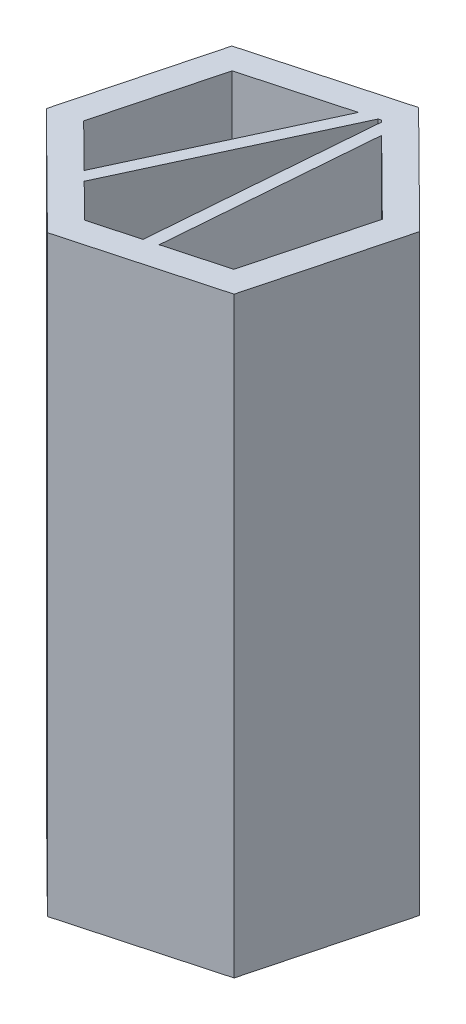
ISO-10303-21;
HEADER;
FILE_DESCRIPTION(('STEP AP214'),'2;1');
FILE_NAME('part.step','',(''),(''),'','','');
FILE_SCHEMA(('AUTOMOTIVE_DESIGN { 1 0 10303 214 1 1 1 1 }'));
ENDSEC;
DATA;
#1=APPLICATION_CONTEXT('core data for automotive mechanical design processes');
#2=APPLICATION_PROTOCOL_DEFINITION('international standard','automotive_design',2000,#1);
#3=PRODUCT_CONTEXT('',#1,'mechanical');
#4=PRODUCT('Part','Part','',(#3));
#5=PRODUCT_RELATED_PRODUCT_CATEGORY('part','',(#4));
#6=PRODUCT_DEFINITION_FORMATION('','',#4);
#7=PRODUCT_DEFINITION_CONTEXT('part definition',#1,'design');
#8=PRODUCT_DEFINITION('design','',#6,#7);
#9=PRODUCT_DEFINITION_SHAPE('','',#8);
#10=(LENGTH_UNIT() NAMED_UNIT(*) SI_UNIT(.MILLI.,.METRE.));
#11=(NAMED_UNIT(*) PLANE_ANGLE_UNIT() SI_UNIT($,.RADIAN.));
#12=(NAMED_UNIT(*) SI_UNIT($,.STERADIAN.) SOLID_ANGLE_UNIT());
#13=UNCERTAINTY_MEASURE_WITH_UNIT(LENGTH_MEASURE(1.E-05),#10,'distance_accuracy_value','');
#14=(GEOMETRIC_REPRESENTATION_CONTEXT(3) GLOBAL_UNCERTAINTY_ASSIGNED_CONTEXT((#13)) GLOBAL_UNIT_ASSIGNED_CONTEXT((#10,
#11,#12)) REPRESENTATION_CONTEXT('',''));
#15=CARTESIAN_POINT('',(0.,0.,0.));
#16=DIRECTION('',(0.,0.,1.));
#17=DIRECTION('',(1.,0.,0.));
#18=AXIS2_PLACEMENT_3D('',#15,#16,#17);
#19=CARTESIAN_POINT('',(-2.34599991066505,45.,8.93474217605035));
#20=DIRECTION('',(-0.263669614670392,0.,-0.964613048999218));
#21=DIRECTION('',(-0.964613048999218,0.,0.263669614670392));
#22=AXIS2_PLACEMENT_3D('',#19,#20,#21);
#23=PLANE('',#22);
#24=DIRECTION('',(0.,1.,0.));
#25=VECTOR('',#24,1.);
#26=CARTESIAN_POINT('',(1.14474386836392,0.,7.98057400666413));
#27=LINE('',#26,#25);
#28=CARTESIAN_POINT('',(1.14474386836392,0.,7.98057400666413));
#29=VERTEX_POINT('',#28);
#30=CARTESIAN_POINT('',(1.14474386836392,45.,7.98057400666413));
#31=VERTEX_POINT('',#30);
#32=EDGE_CURVE('E211',#29,#31,#27,.T.);
#33=ORIENTED_EDGE('',*,*,#32,.F.);
#34=DIRECTION('',(0.964613048999218,0.,-0.263669614670392));
#35=VECTOR('',#34,1.);
#36=CARTESIAN_POINT('',(-2.34599991066505,0.,8.93474217605035));
#37=LINE('',#36,#35);
#38=CARTESIAN_POINT('',(-2.34599991066505,0.,8.93474217605035));
#39=VERTEX_POINT('',#38);
#40=EDGE_CURVE('E275',#39,#29,#37,.T.);
#41=ORIENTED_EDGE('',*,*,#40,.F.);
#42=DIRECTION('',(0.,-1.,0.));
#43=VECTOR('',#42,1.);
#44=CARTESIAN_POINT('',(-2.34599991066505,45.,8.93474217605035));
#45=LINE('',#44,#43);
#46=CARTESIAN_POINT('',(-2.34599991066505,45.,8.93474217605035));
#47=VERTEX_POINT('',#46);
#48=EDGE_CURVE('E314',#47,#39,#45,.T.);
#49=ORIENTED_EDGE('',*,*,#48,.F.);
#50=DIRECTION('',(0.964613048999218,0.,-0.263669614670392));
#51=VECTOR('',#50,1.);
#52=CARTESIAN_POINT('',(-2.34599991066505,45.,8.93474217605035));
#53=LINE('',#52,#51);
#54=EDGE_CURVE('E55',#47,#31,#53,.T.);
#55=ORIENTED_EDGE('',*,*,#54,.T.);
#56=EDGE_LOOP('',(#33,#41,#49,#55));
#57=FACE_BOUND('',#56,.T.);
#58=ADVANCED_FACE('F39',(#57),#23,.T.);
#59=CARTESIAN_POINT('',(8.91071365605638,45.,-2.43567556811322));
#60=DIRECTION('',(-0.703544597920089,0.,0.710651109010223));
#61=DIRECTION('',(0.710651109010223,0.,0.703544597920089));
#62=AXIS2_PLACEMENT_3D('',#59,#60,#61);
#63=PLANE('',#62);
#64=DIRECTION('',(0.,1.,0.));
#65=VECTOR('',#64,1.);
#66=CARTESIAN_POINT('',(2.48813013246709,0.,-8.79403325646633));
#67=LINE('',#66,#65);
#68=CARTESIAN_POINT('',(2.48813013246709,0.,-8.79403325646633));
#69=VERTEX_POINT('',#68);
#70=CARTESIAN_POINT('',(2.48813013246709,45.,-8.79403325646633));
#71=VERTEX_POINT('',#70);
#72=EDGE_CURVE('E215',#69,#71,#67,.T.);
#73=ORIENTED_EDGE('',*,*,#72,.T.);
#74=DIRECTION('',(-0.710651109010223,0.,-0.703544597920089));
#75=VECTOR('',#74,1.);
#76=CARTESIAN_POINT('',(8.91071365605638,45.,-2.43567556811322));
#77=LINE('',#76,#75);
#78=CARTESIAN_POINT('',(2.34599991066505,45.,-8.93474217605035));
#79=VERTEX_POINT('',#78);
#80=EDGE_CURVE('E259',#71,#79,#77,.T.);
#81=ORIENTED_EDGE('',*,*,#80,.T.);
#82=DIRECTION('',(0.,-1.,0.));
#83=VECTOR('',#82,1.);
#84=CARTESIAN_POINT('',(2.34599991066505,45.,-8.93474217605035));
#85=LINE('',#84,#83);
#86=CARTESIAN_POINT('',(2.34599991066505,0.,-8.93474217605035));
#87=VERTEX_POINT('',#86);
#88=EDGE_CURVE('E304',#79,#87,#85,.T.);
#89=ORIENTED_EDGE('',*,*,#88,.T.);
#90=DIRECTION('',(-0.710651109010223,0.,-0.703544597920089));
#91=VECTOR('',#90,1.);
#92=CARTESIAN_POINT('',(8.91071365605638,0.,-2.43567556811322));
#93=LINE('',#92,#91);
#94=EDGE_CURVE('E283',#69,#87,#93,.T.);
#95=ORIENTED_EDGE('',*,*,#94,.F.);
#96=EDGE_LOOP('',(#73,#81,#89,#95));
#97=FACE_BOUND('',#96,.T.);
#98=ADVANCED_FACE('F418',(#97),#63,.T.);
#99=CARTESIAN_POINT('',(-8.91071365605638,45.,2.43567556811322));
#100=DIRECTION('',(0.703544597920089,0.,-0.710651109010223));
#101=DIRECTION('',(-0.710651109010223,0.,-0.703544597920089));
#102=AXIS2_PLACEMENT_3D('',#99,#100,#101);
#103=PLANE('',#102);
#104=DIRECTION('',(0.,1.,0.));
#105=VECTOR('',#104,1.);
#106=CARTESIAN_POINT('',(-5.62835678336072,0.,5.68520887208178));
#107=LINE('',#106,#105);
#108=CARTESIAN_POINT('',(-5.62835678336072,0.,5.68520887208178));
#109=VERTEX_POINT('',#108);
#110=CARTESIAN_POINT('',(-5.62835678336072,45.,5.68520887208178));
#111=VERTEX_POINT('',#110);
#112=EDGE_CURVE('E237',#109,#111,#107,.T.);
#113=ORIENTED_EDGE('',*,*,#112,.F.);
#114=DIRECTION('',(0.710651109010223,0.,0.703544597920089));
#115=VECTOR('',#114,1.);
#116=CARTESIAN_POINT('',(-8.91071365605638,0.,2.43567556811322));
#117=LINE('',#116,#115);
#118=CARTESIAN_POINT('',(-8.91071365605638,0.,2.43567556811322));
#119=VERTEX_POINT('',#118);
#120=EDGE_CURVE('E271',#119,#109,#117,.T.);
#121=ORIENTED_EDGE('',*,*,#120,.F.);
#122=DIRECTION('',(0.,-1.,0.));
#123=VECTOR('',#122,1.);
#124=CARTESIAN_POINT('',(-8.91071365605638,45.,2.43567556811322));
#125=LINE('',#124,#123);
#126=CARTESIAN_POINT('',(-8.91071365605638,45.,2.43567556811322));
#127=VERTEX_POINT('',#126);
#128=EDGE_CURVE('E270',#127,#119,#125,.T.);
#129=ORIENTED_EDGE('',*,*,#128,.F.);
#130=DIRECTION('',(0.710651109010223,0.,0.703544597920089));
#131=VECTOR('',#130,1.);
#132=CARTESIAN_POINT('',(-8.91071365605638,45.,2.43567556811322));
#133=LINE('',#132,#131);
#134=EDGE_CURVE('E188',#127,#111,#133,.T.);
#135=ORIENTED_EDGE('',*,*,#134,.T.);
#136=EDGE_LOOP('',(#113,#121,#129,#135));
#137=FACE_BOUND('',#136,.T.);
#138=ADVANCED_FACE('F414',(#137),#103,.T.);
#139=CARTESIAN_POINT('',(2.34599991066505,45.,-8.93474217605035));
#140=DIRECTION('',(0.263669614670392,0.,0.964613048999217));
#141=DIRECTION('',(0.964613048999218,0.,-0.263669614670392));
#142=AXIS2_PLACEMENT_3D('',#139,#140,#141);
#143=PLANE('',#142);
#144=DIRECTION('',(0.,1.,0.));
#145=VECTOR('',#144,1.);
#146=CARTESIAN_POINT('',(0.966484516861694,0.,-8.55766217211159));
#147=LINE('',#146,#145);
#148=CARTESIAN_POINT('',(0.966484516861695,0.,-8.55766217211159));
#149=VERTEX_POINT('',#148);
#150=CARTESIAN_POINT('',(0.966484516861694,45.,-8.55766217211159));
#151=VERTEX_POINT('',#150);
#152=EDGE_CURVE('E242',#149,#151,#147,.T.);
#153=ORIENTED_EDGE('',*,*,#152,.T.);
#154=DIRECTION('',(-0.964613048999217,0.,0.263669614670392));
#155=VECTOR('',#154,1.);
#156=CARTESIAN_POINT('',(2.34599991066505,45.,-8.93474217605035));
#157=LINE('',#156,#155);
#158=CARTESIAN_POINT('',(-6.56471374539133,45.,-6.49906660793713));
#159=VERTEX_POINT('',#158);
#160=EDGE_CURVE('E263',#151,#159,#157,.T.);
#161=ORIENTED_EDGE('',*,*,#160,.T.);
#162=DIRECTION('',(0.,-1.,0.));
#163=VECTOR('',#162,1.);
#164=CARTESIAN_POINT('',(-6.56471374539133,45.,-6.49906660793713));
#165=LINE('',#164,#163);
#166=CARTESIAN_POINT('',(-6.56471374539133,0.,-6.49906660793713));
#167=VERTEX_POINT('',#166);
#168=EDGE_CURVE('E300',#159,#167,#165,.T.);
#169=ORIENTED_EDGE('',*,*,#168,.T.);
#170=DIRECTION('',(-0.964613048999217,0.,0.263669614670392));
#171=VECTOR('',#170,1.);
#172=CARTESIAN_POINT('',(2.34599991066505,0.,-8.93474217605035));
#173=LINE('',#172,#171);
#174=EDGE_CURVE('E288',#149,#167,#173,.T.);
#175=ORIENTED_EDGE('',*,*,#174,.F.);
#176=EDGE_LOOP('',(#153,#161,#169,#175));
#177=FACE_BOUND('',#176,.T.);
#178=ADVANCED_FACE('F444',(#177),#143,.T.);
#179=CARTESIAN_POINT('',(0.,45.,0.));
#180=DIRECTION('',(0.,1.,0.));
#181=DIRECTION('',(0.,0.,1.));
#182=AXIS2_PLACEMENT_3D('',#179,#180,#181);
#183=PLANE('',#182);
#184=CARTESIAN_POINT('',(2.10935691736314,45.,7.71690439199374));
#185=VERTEX_POINT('',#184);
#186=CARTESIAN_POINT('',(6.56471374539133,45.,6.49906660793713));
#187=VERTEX_POINT('',#186);
#188=EDGE_CURVE('E179',#185,#187,#53,.T.);
#189=ORIENTED_EDGE('',*,*,#188,.F.);
#190=DIRECTION('',(0.0798289301867088,0.,-0.996808578366602));
#191=VECTOR('',#190,1.);
#192=CARTESIAN_POINT('',(2.10935691736314,45.,7.71690439199374));
#193=LINE('',#192,#191);
#194=CARTESIAN_POINT('',(3.36231847023682,45.,-7.92858680207433));
#195=VERTEX_POINT('',#194);
#196=EDGE_CURVE('E184',#185,#195,#193,.T.);
#197=ORIENTED_EDGE('',*,*,#196,.T.);
#198=CARTESIAN_POINT('',(8.91071365605638,45.,-2.43567556811322));
#199=VERTEX_POINT('',#198);
#200=EDGE_CURVE('E260',#199,#195,#77,.T.);
#201=ORIENTED_EDGE('',*,*,#200,.F.);
#202=DIRECTION('',(0.253961939988995,0.,-0.967214212590482));
#203=VECTOR('',#202,1.);
#204=CARTESIAN_POINT('',(6.56471374539133,45.,6.49906660793713));
#205=LINE('',#204,#203);
#206=EDGE_CURVE('E185',#187,#199,#205,.T.);
#207=ORIENTED_EDGE('',*,*,#206,.F.);
#208=EDGE_LOOP('',(#189,#197,#201,#207));
#209=FACE_BOUND('',#208,.T.);
#210=CARTESIAN_POINT('',(-4.91770567435049,45.,6.38875347000187));
#211=VERTEX_POINT('',#210);
#212=EDGE_CURVE('E254',#211,#47,#133,.T.);
#213=ORIENTED_EDGE('',*,*,#212,.F.);
#214=DIRECTION('',(0.420171811769034,0.,-0.907444570535703));
#215=VECTOR('',#214,1.);
#216=CARTESIAN_POINT('',(2.1530773008652,45.,-8.88200825311627));
#217=LINE('',#216,#215);
#218=CARTESIAN_POINT('',(2.1530773008652,45.,-8.88200825311627));
#219=VERTEX_POINT('',#218);
#220=EDGE_CURVE('E214',#211,#219,#217,.T.);
#221=ORIENTED_EDGE('',*,*,#220,.T.);
#222=EDGE_CURVE('E264',#79,#219,#157,.T.);
#223=ORIENTED_EDGE('',*,*,#222,.F.);
#224=ORIENTED_EDGE('',*,*,#80,.F.);
#225=DIRECTION('',(-0.079828930186709,0.,0.996808578366602));
#226=VECTOR('',#225,1.);
#227=CARTESIAN_POINT('',(2.48813013246709,45.,-8.79403325646633));
#228=LINE('',#227,#226);
#229=EDGE_CURVE('E202',#71,#31,#228,.T.);
#230=ORIENTED_EDGE('',*,*,#229,.T.);
#231=ORIENTED_EDGE('',*,*,#54,.F.);
#232=EDGE_LOOP('',(#213,#221,#223,#224,#230,#231));
#233=FACE_BOUND('',#232,.T.);
#234=DIRECTION('',(0.964613048999218,0.,-0.263669614670392));
#235=VECTOR('',#234,1.);
#236=CARTESIAN_POINT('',(-2.93249988833132,45.,11.1684277200629));
#237=LINE('',#236,#235);
#238=CARTESIAN_POINT('',(-2.93249988833132,45.,11.1684277200629));
#239=VERTEX_POINT('',#238);
#240=CARTESIAN_POINT('',(8.20589218173916,45.,8.12383325992142));
#241=VERTEX_POINT('',#240);
#242=EDGE_CURVE('E319',#239,#241,#237,.T.);
#243=ORIENTED_EDGE('',*,*,#242,.T.);
#244=DIRECTION('',(0.253961939988995,0.,-0.967214212590482));
#245=VECTOR('',#244,1.);
#246=CARTESIAN_POINT('',(8.20589218173916,45.,8.12383325992142));
#247=LINE('',#246,#245);
#248=CARTESIAN_POINT('',(11.1383920700705,45.,-3.04459446014152));
#249=VERTEX_POINT('',#248);
#250=EDGE_CURVE('E323',#241,#249,#247,.T.);
#251=ORIENTED_EDGE('',*,*,#250,.T.);
#252=DIRECTION('',(-0.710651109010223,0.,-0.703544597920089));
#253=VECTOR('',#252,1.);
#254=CARTESIAN_POINT('',(11.1383920700705,45.,-3.04459446014152));
#255=LINE('',#254,#253);
#256=CARTESIAN_POINT('',(2.93249988833131,45.,-11.1684277200629));
#257=VERTEX_POINT('',#256);
#258=EDGE_CURVE('E327',#249,#257,#255,.T.);
#259=ORIENTED_EDGE('',*,*,#258,.T.);
#260=DIRECTION('',(-0.964613048999218,0.,0.263669614670392));
#261=VECTOR('',#260,1.);
#262=CARTESIAN_POINT('',(2.93249988833131,45.,-11.1684277200629));
#263=LINE('',#262,#261);
#264=CARTESIAN_POINT('',(-8.20589218173916,45.,-8.12383325992142));
#265=VERTEX_POINT('',#264);
#266=EDGE_CURVE('E330',#257,#265,#263,.T.);
#267=ORIENTED_EDGE('',*,*,#266,.T.);
#268=DIRECTION('',(-0.253961939988995,0.,0.967214212590482));
#269=VECTOR('',#268,1.);
#270=CARTESIAN_POINT('',(-8.20589218173916,45.,-8.12383325992142));
#271=LINE('',#270,#269);
#272=CARTESIAN_POINT('',(-11.1383920700705,45.,3.04459446014152));
#273=VERTEX_POINT('',#272);
#274=EDGE_CURVE('E333',#265,#273,#271,.T.);
#275=ORIENTED_EDGE('',*,*,#274,.T.);
#276=DIRECTION('',(0.710651109010223,0.,0.70354459792009));
#277=VECTOR('',#276,1.);
#278=CARTESIAN_POINT('',(-11.1383920700705,45.,3.04459446014152));
#279=LINE('',#278,#277);
#280=EDGE_CURVE('E336',#273,#239,#279,.T.);
#281=ORIENTED_EDGE('',*,*,#280,.T.);
#282=EDGE_LOOP('',(#243,#251,#259,#267,#275,#281));
#283=FACE_BOUND('',#282,.T.);
#284=DIRECTION('',(-0.420171811769034,0.,0.907444570535703));
#285=VECTOR('',#284,1.);
#286=CARTESIAN_POINT('',(-5.62835678336072,45.,5.68520887208178));
#287=LINE('',#286,#285);
#288=EDGE_CURVE('E226',#151,#111,#287,.T.);
#289=ORIENTED_EDGE('',*,*,#288,.T.);
#290=ORIENTED_EDGE('',*,*,#134,.F.);
#291=DIRECTION('',(-0.253961939988995,0.,0.967214212590482));
#292=VECTOR('',#291,1.);
#293=CARTESIAN_POINT('',(-6.56471374539133,45.,-6.49906660793713));
#294=LINE('',#293,#292);
#295=EDGE_CURVE('E267',#159,#127,#294,.T.);
#296=ORIENTED_EDGE('',*,*,#295,.F.);
#297=ORIENTED_EDGE('',*,*,#160,.F.);
#298=EDGE_LOOP('',(#289,#290,#296,#297));
#299=FACE_BOUND('',#298,.T.);
#300=ADVANCED_FACE('F180',(#209,#233,#283,#299),#183,.T.);
#301=CARTESIAN_POINT('',(0.,0.,0.));
#302=DIRECTION('',(0.,1.,0.));
#303=DIRECTION('',(0.,0.,1.));
#304=AXIS2_PLACEMENT_3D('',#301,#302,#303);
#305=PLANE('',#304);
#306=DIRECTION('',(0.0798289301867088,0.,-0.996808578366602));
#307=VECTOR('',#306,1.);
#308=CARTESIAN_POINT('',(2.10935691736314,0.,7.71690439199374));
#309=LINE('',#308,#307);
#310=CARTESIAN_POINT('',(2.10935691736314,0.,7.71690439199374));
#311=VERTEX_POINT('',#310);
#312=CARTESIAN_POINT('',(3.36231847023682,0.,-7.92858680207433));
#313=VERTEX_POINT('',#312);
#314=EDGE_CURVE('E206',#311,#313,#309,.T.);
#315=ORIENTED_EDGE('',*,*,#314,.F.);
#316=CARTESIAN_POINT('',(6.56471374539133,0.,6.49906660793713));
#317=VERTEX_POINT('',#316);
#318=EDGE_CURVE('E63',#311,#317,#37,.T.);
#319=ORIENTED_EDGE('',*,*,#318,.T.);
#320=DIRECTION('',(0.253961939988995,0.,-0.967214212590482));
#321=VECTOR('',#320,1.);
#322=CARTESIAN_POINT('',(6.56471374539133,0.,6.49906660793713));
#323=LINE('',#322,#321);
#324=CARTESIAN_POINT('',(8.91071365605638,0.,-2.43567556811322));
#325=VERTEX_POINT('',#324);
#326=EDGE_CURVE('E279',#317,#325,#323,.T.);
#327=ORIENTED_EDGE('',*,*,#326,.T.);
#328=EDGE_CURVE('E284',#325,#313,#93,.T.);
#329=ORIENTED_EDGE('',*,*,#328,.T.);
#330=EDGE_LOOP('',(#315,#319,#327,#329));
#331=FACE_BOUND('',#330,.T.);
#332=DIRECTION('',(0.420171811769034,0.,-0.907444570535703));
#333=VECTOR('',#332,1.);
#334=CARTESIAN_POINT('',(2.1530773008652,0.,-8.88200825311627));
#335=LINE('',#334,#333);
#336=CARTESIAN_POINT('',(-4.9177056743505,0.,6.38875347000187));
#337=VERTEX_POINT('',#336);
#338=CARTESIAN_POINT('',(2.1530773008652,0.,-8.88200825311627));
#339=VERTEX_POINT('',#338);
#340=EDGE_CURVE('E221',#337,#339,#335,.T.);
#341=ORIENTED_EDGE('',*,*,#340,.F.);
#342=EDGE_CURVE('E241',#337,#39,#117,.T.);
#343=ORIENTED_EDGE('',*,*,#342,.T.);
#344=ORIENTED_EDGE('',*,*,#40,.T.);
#345=DIRECTION('',(-0.079828930186709,0.,0.996808578366602));
#346=VECTOR('',#345,1.);
#347=CARTESIAN_POINT('',(2.48813013246709,0.,-8.79403325646633));
#348=LINE('',#347,#346);
#349=EDGE_CURVE('E197',#69,#29,#348,.T.);
#350=ORIENTED_EDGE('',*,*,#349,.F.);
#351=ORIENTED_EDGE('',*,*,#94,.T.);
#352=EDGE_CURVE('E289',#87,#339,#173,.T.);
#353=ORIENTED_EDGE('',*,*,#352,.T.);
#354=EDGE_LOOP('',(#341,#343,#344,#350,#351,#353));
#355=FACE_BOUND('',#354,.T.);
#356=DIRECTION('',(0.964613048999218,0.,-0.263669614670392));
#357=VECTOR('',#356,1.);
#358=CARTESIAN_POINT('',(-2.93249988833132,0.,11.1684277200629));
#359=LINE('',#358,#357);
#360=CARTESIAN_POINT('',(-2.93249988833132,0.,11.1684277200629));
#361=VERTEX_POINT('',#360);
#362=CARTESIAN_POINT('',(8.20589218173916,0.,8.12383325992142));
#363=VERTEX_POINT('',#362);
#364=EDGE_CURVE('E318',#361,#363,#359,.T.);
#365=ORIENTED_EDGE('',*,*,#364,.F.);
#366=DIRECTION('',(0.710651109010223,0.,0.70354459792009));
#367=VECTOR('',#366,1.);
#368=CARTESIAN_POINT('',(-11.1383920700705,0.,3.04459446014152));
#369=LINE('',#368,#367);
#370=CARTESIAN_POINT('',(-11.1383920700705,0.,3.04459446014152));
#371=VERTEX_POINT('',#370);
#372=EDGE_CURVE('E324',#371,#361,#369,.T.);
#373=ORIENTED_EDGE('',*,*,#372,.F.);
#374=DIRECTION('',(-0.253961939988995,0.,0.967214212590482));
#375=VECTOR('',#374,1.);
#376=CARTESIAN_POINT('',(-8.20589218173916,0.,-8.12383325992142));
#377=LINE('',#376,#375);
#378=CARTESIAN_POINT('',(-8.20589218173916,0.,-8.12383325992142));
#379=VERTEX_POINT('',#378);
#380=EDGE_CURVE('E352',#379,#371,#377,.T.);
#381=ORIENTED_EDGE('',*,*,#380,.F.);
#382=DIRECTION('',(-0.964613048999218,0.,0.263669614670392));
#383=VECTOR('',#382,1.);
#384=CARTESIAN_POINT('',(2.93249988833131,0.,-11.1684277200629));
#385=LINE('',#384,#383);
#386=CARTESIAN_POINT('',(2.93249988833131,0.,-11.1684277200629));
#387=VERTEX_POINT('',#386);
#388=EDGE_CURVE('E349',#387,#379,#385,.T.);
#389=ORIENTED_EDGE('',*,*,#388,.F.);
#390=DIRECTION('',(-0.710651109010223,0.,-0.703544597920089));
#391=VECTOR('',#390,1.);
#392=CARTESIAN_POINT('',(11.1383920700705,0.,-3.04459446014152));
#393=LINE('',#392,#391);
#394=CARTESIAN_POINT('',(11.1383920700705,0.,-3.04459446014152));
#395=VERTEX_POINT('',#394);
#396=EDGE_CURVE('E346',#395,#387,#393,.T.);
#397=ORIENTED_EDGE('',*,*,#396,.F.);
#398=DIRECTION('',(0.253961939988995,0.,-0.967214212590482));
#399=VECTOR('',#398,1.);
#400=CARTESIAN_POINT('',(8.20589218173916,0.,8.12383325992142));
#401=LINE('',#400,#399);
#402=EDGE_CURVE('E343',#363,#395,#401,.T.);
#403=ORIENTED_EDGE('',*,*,#402,.F.);
#404=EDGE_LOOP('',(#365,#373,#381,#389,#397,#403));
#405=FACE_BOUND('',#404,.T.);
#406=ORIENTED_EDGE('',*,*,#120,.T.);
#407=DIRECTION('',(-0.420171811769034,0.,0.907444570535703));
#408=VECTOR('',#407,1.);
#409=CARTESIAN_POINT('',(-5.62835678336072,0.,5.68520887208178));
#410=LINE('',#409,#408);
#411=EDGE_CURVE('E225',#149,#109,#410,.T.);
#412=ORIENTED_EDGE('',*,*,#411,.F.);
#413=ORIENTED_EDGE('',*,*,#174,.T.);
#414=DIRECTION('',(-0.253961939988995,0.,0.967214212590482));
#415=VECTOR('',#414,1.);
#416=CARTESIAN_POINT('',(-6.56471374539133,0.,-6.49906660793713));
#417=LINE('',#416,#415);
#418=EDGE_CURVE('E293',#167,#119,#417,.T.);
#419=ORIENTED_EDGE('',*,*,#418,.T.);
#420=EDGE_LOOP('',(#406,#412,#413,#419));
#421=FACE_BOUND('',#420,.T.);
#422=ADVANCED_FACE('F383',(#331,#355,#405,#421),#305,.F.);
#423=CARTESIAN_POINT('',(-2.93249988833132,45.,11.1684277200629));
#424=DIRECTION('',(-0.263669614670392,0.,-0.964613048999217));
#425=DIRECTION('',(-0.964613048999218,0.,0.263669614670392));
#426=AXIS2_PLACEMENT_3D('',#423,#424,#425);
#427=PLANE('',#426);
#428=ORIENTED_EDGE('',*,*,#364,.T.);
#429=DIRECTION('',(0.,-1.,0.));
#430=VECTOR('',#429,1.);
#431=CARTESIAN_POINT('',(8.20589218173916,45.,8.12383325992142));
#432=LINE('',#431,#430);
#433=EDGE_CURVE('E11',#241,#363,#432,.T.);
#434=ORIENTED_EDGE('',*,*,#433,.F.);
#435=ORIENTED_EDGE('',*,*,#242,.F.);
#436=DIRECTION('',(0.,-1.,0.));
#437=VECTOR('',#436,1.);
#438=CARTESIAN_POINT('',(-2.93249988833132,45.,11.1684277200629));
#439=LINE('',#438,#437);
#440=EDGE_CURVE('E339',#239,#361,#439,.T.);
#441=ORIENTED_EDGE('',*,*,#440,.T.);
#442=EDGE_LOOP('',(#428,#434,#435,#441));
#443=FACE_BOUND('',#442,.T.);
#444=ADVANCED_FACE('F41',(#443),#427,.F.);
#445=CARTESIAN_POINT('',(8.20589218173916,45.,8.12383325992142));
#446=DIRECTION('',(-0.967214212590482,0.,-0.253961939988995));
#447=DIRECTION('',(-0.253961939988995,0.,0.967214212590482));
#448=AXIS2_PLACEMENT_3D('',#445,#446,#447);
#449=PLANE('',#448);
#450=ORIENTED_EDGE('',*,*,#402,.T.);
#451=DIRECTION('',(0.,-1.,0.));
#452=VECTOR('',#451,1.);
#453=CARTESIAN_POINT('',(11.1383920700705,45.,-3.04459446014152));
#454=LINE('',#453,#452);
#455=EDGE_CURVE('E48',#249,#395,#454,.T.);
#456=ORIENTED_EDGE('',*,*,#455,.F.);
#457=ORIENTED_EDGE('',*,*,#250,.F.);
#458=ORIENTED_EDGE('',*,*,#433,.T.);
#459=EDGE_LOOP('',(#450,#456,#457,#458));
#460=FACE_BOUND('',#459,.T.);
#461=ADVANCED_FACE('F401',(#460),#449,.F.);
#462=CARTESIAN_POINT('',(11.1383920700705,45.,-3.04459446014152));
#463=DIRECTION('',(-0.703544597920089,0.,0.710651109010223));
#464=DIRECTION('',(0.710651109010223,0.,0.703544597920089));
#465=AXIS2_PLACEMENT_3D('',#462,#463,#464);
#466=PLANE('',#465);
#467=ORIENTED_EDGE('',*,*,#396,.T.);
#468=DIRECTION('',(0.,-1.,0.));
#469=VECTOR('',#468,1.);
#470=CARTESIAN_POINT('',(2.93249988833131,45.,-11.1684277200629));
#471=LINE('',#470,#469);
#472=EDGE_CURVE('E368',#257,#387,#471,.T.);
#473=ORIENTED_EDGE('',*,*,#472,.F.);
#474=ORIENTED_EDGE('',*,*,#258,.F.);
#475=ORIENTED_EDGE('',*,*,#455,.T.);
#476=EDGE_LOOP('',(#467,#473,#474,#475));
#477=FACE_BOUND('',#476,.T.);
#478=ADVANCED_FACE('F377',(#477),#466,.F.);
#479=CARTESIAN_POINT('',(2.93249988833131,45.,-11.1684277200629));
#480=DIRECTION('',(0.263669614670392,0.,0.964613048999217));
#481=DIRECTION('',(0.964613048999218,0.,-0.263669614670392));
#482=AXIS2_PLACEMENT_3D('',#479,#480,#481);
#483=PLANE('',#482);
#484=ORIENTED_EDGE('',*,*,#388,.T.);
#485=DIRECTION('',(0.,-1.,0.));
#486=VECTOR('',#485,1.);
#487=CARTESIAN_POINT('',(-8.20589218173916,45.,-8.12383325992142));
#488=LINE('',#487,#486);
#489=EDGE_CURVE('E364',#265,#379,#488,.T.);
#490=ORIENTED_EDGE('',*,*,#489,.F.);
#491=ORIENTED_EDGE('',*,*,#266,.F.);
#492=ORIENTED_EDGE('',*,*,#472,.T.);
#493=EDGE_LOOP('',(#484,#490,#491,#492));
#494=FACE_BOUND('',#493,.T.);
#495=ADVANCED_FACE('F389',(#494),#483,.F.);
#496=CARTESIAN_POINT('',(-8.20589218173916,45.,-8.12383325992142));
#497=DIRECTION('',(0.967214212590482,0.,0.253961939988995));
#498=DIRECTION('',(0.253961939988995,0.,-0.967214212590482));
#499=AXIS2_PLACEMENT_3D('',#496,#497,#498);
#500=PLANE('',#499);
#501=ORIENTED_EDGE('',*,*,#380,.T.);
#502=DIRECTION('',(0.,-1.,0.));
#503=VECTOR('',#502,1.);
#504=CARTESIAN_POINT('',(-11.1383920700705,45.,3.04459446014152));
#505=LINE('',#504,#503);
#506=EDGE_CURVE('E360',#273,#371,#505,.T.);
#507=ORIENTED_EDGE('',*,*,#506,.F.);
#508=ORIENTED_EDGE('',*,*,#274,.F.);
#509=ORIENTED_EDGE('',*,*,#489,.T.);
#510=EDGE_LOOP('',(#501,#507,#508,#509));
#511=FACE_BOUND('',#510,.T.);
#512=ADVANCED_FACE('F393',(#511),#500,.F.);
#513=CARTESIAN_POINT('',(-11.1383920700705,45.,3.04459446014152));
#514=DIRECTION('',(0.70354459792009,0.,-0.710651109010223));
#515=DIRECTION('',(-0.710651109010223,0.,-0.70354459792009));
#516=AXIS2_PLACEMENT_3D('',#513,#514,#515);
#517=PLANE('',#516);
#518=ORIENTED_EDGE('',*,*,#372,.T.);
#519=ORIENTED_EDGE('',*,*,#440,.F.);
#520=ORIENTED_EDGE('',*,*,#280,.F.);
#521=ORIENTED_EDGE('',*,*,#506,.T.);
#522=EDGE_LOOP('',(#518,#519,#520,#521));
#523=FACE_BOUND('',#522,.T.);
#524=ADVANCED_FACE('F404',(#523),#517,.F.);
#525=DIRECTION('',(0.,1.,0.));
#526=VECTOR('',#525,1.);
#527=CARTESIAN_POINT('',(-4.91770567435049,0.,6.38875347000187));
#528=LINE('',#527,#526);
#529=EDGE_CURVE('E230',#337,#211,#528,.T.);
#530=ORIENTED_EDGE('',*,*,#529,.T.);
#531=ORIENTED_EDGE('',*,*,#212,.T.);
#532=ORIENTED_EDGE('',*,*,#48,.T.);
#533=ORIENTED_EDGE('',*,*,#342,.F.);
#534=EDGE_LOOP('',(#530,#531,#532,#533));
#535=FACE_BOUND('',#534,.T.);
#536=ADVANCED_FACE('F406',(#535),#103,.T.);
#537=DIRECTION('',(0.,1.,0.));
#538=VECTOR('',#537,1.);
#539=CARTESIAN_POINT('',(2.10935691736314,0.,7.71690439199374));
#540=LINE('',#539,#538);
#541=EDGE_CURVE('E190',#311,#185,#540,.T.);
#542=ORIENTED_EDGE('',*,*,#541,.T.);
#543=ORIENTED_EDGE('',*,*,#188,.T.);
#544=DIRECTION('',(0.,-1.,0.));
#545=VECTOR('',#544,1.);
#546=CARTESIAN_POINT('',(6.56471374539133,45.,6.49906660793713));
#547=LINE('',#546,#545);
#548=EDGE_CURVE('E311',#187,#317,#547,.T.);
#549=ORIENTED_EDGE('',*,*,#548,.T.);
#550=ORIENTED_EDGE('',*,*,#318,.F.);
#551=EDGE_LOOP('',(#542,#543,#549,#550));
#552=FACE_BOUND('',#551,.T.);
#553=ADVANCED_FACE('F191',(#552),#23,.T.);
#554=CARTESIAN_POINT('',(6.56471374539133,45.,6.49906660793713));
#555=DIRECTION('',(-0.967214212590482,0.,-0.253961939988995));
#556=DIRECTION('',(-0.253961939988995,0.,0.967214212590482));
#557=AXIS2_PLACEMENT_3D('',#554,#555,#556);
#558=PLANE('',#557);
#559=ORIENTED_EDGE('',*,*,#326,.F.);
#560=ORIENTED_EDGE('',*,*,#548,.F.);
#561=ORIENTED_EDGE('',*,*,#206,.T.);
#562=DIRECTION('',(0.,-1.,0.));
#563=VECTOR('',#562,1.);
#564=CARTESIAN_POINT('',(8.91071365605638,45.,-2.43567556811322));
#565=LINE('',#564,#563);
#566=EDGE_CURVE('E308',#199,#325,#565,.T.);
#567=ORIENTED_EDGE('',*,*,#566,.T.);
#568=EDGE_LOOP('',(#559,#560,#561,#567));
#569=FACE_BOUND('',#568,.T.);
#570=ADVANCED_FACE('F428',(#569),#558,.T.);
#571=DIRECTION('',(0.,1.,0.));
#572=VECTOR('',#571,1.);
#573=CARTESIAN_POINT('',(3.36231847023682,0.,-7.92858680207433));
#574=LINE('',#573,#572);
#575=EDGE_CURVE('E196',#313,#195,#574,.T.);
#576=ORIENTED_EDGE('',*,*,#575,.F.);
#577=ORIENTED_EDGE('',*,*,#328,.F.);
#578=ORIENTED_EDGE('',*,*,#566,.F.);
#579=ORIENTED_EDGE('',*,*,#200,.T.);
#580=EDGE_LOOP('',(#576,#577,#578,#579));
#581=FACE_BOUND('',#580,.T.);
#582=ADVANCED_FACE('F425',(#581),#63,.T.);
#583=DIRECTION('',(0.,1.,0.));
#584=VECTOR('',#583,1.);
#585=CARTESIAN_POINT('',(2.1530773008652,0.,-8.88200825311627));
#586=LINE('',#585,#584);
#587=EDGE_CURVE('E246',#339,#219,#586,.T.);
#588=ORIENTED_EDGE('',*,*,#587,.F.);
#589=ORIENTED_EDGE('',*,*,#352,.F.);
#590=ORIENTED_EDGE('',*,*,#88,.F.);
#591=ORIENTED_EDGE('',*,*,#222,.T.);
#592=EDGE_LOOP('',(#588,#589,#590,#591));
#593=FACE_BOUND('',#592,.T.);
#594=ADVANCED_FACE('F436',(#593),#143,.T.);
#595=CARTESIAN_POINT('',(-6.56471374539133,45.,-6.49906660793713));
#596=DIRECTION('',(0.967214212590482,0.,0.253961939988995));
#597=DIRECTION('',(0.253961939988995,0.,-0.967214212590482));
#598=AXIS2_PLACEMENT_3D('',#595,#596,#597);
#599=PLANE('',#598);
#600=ORIENTED_EDGE('',*,*,#418,.F.);
#601=ORIENTED_EDGE('',*,*,#168,.F.);
#602=ORIENTED_EDGE('',*,*,#295,.T.);
#603=ORIENTED_EDGE('',*,*,#128,.T.);
#604=EDGE_LOOP('',(#600,#601,#602,#603));
#605=FACE_BOUND('',#604,.T.);
#606=ADVANCED_FACE('F442',(#605),#599,.T.);
#607=CARTESIAN_POINT('',(-5.62835678336072,0.,5.68520887208178));
#608=DIRECTION('',(-0.907444570535703,0.,-0.420171811769034));
#609=DIRECTION('',(-0.420171811769034,0.,0.907444570535703));
#610=AXIS2_PLACEMENT_3D('',#607,#608,#609);
#611=PLANE('',#610);
#612=ORIENTED_EDGE('',*,*,#288,.F.);
#613=ORIENTED_EDGE('',*,*,#152,.F.);
#614=ORIENTED_EDGE('',*,*,#411,.T.);
#615=ORIENTED_EDGE('',*,*,#112,.T.);
#616=EDGE_LOOP('',(#612,#613,#614,#615));
#617=FACE_BOUND('',#616,.T.);
#618=ADVANCED_FACE('F447',(#617),#611,.T.);
#619=CARTESIAN_POINT('',(2.1530773008652,0.,-8.88200825311627));
#620=DIRECTION('',(0.907444570535703,0.,0.420171811769034));
#621=DIRECTION('',(0.420171811769035,0.,-0.907444570535703));
#622=AXIS2_PLACEMENT_3D('',#619,#620,#621);
#623=PLANE('',#622);
#624=ORIENTED_EDGE('',*,*,#220,.F.);
#625=ORIENTED_EDGE('',*,*,#529,.F.);
#626=ORIENTED_EDGE('',*,*,#340,.T.);
#627=ORIENTED_EDGE('',*,*,#587,.T.);
#628=EDGE_LOOP('',(#624,#625,#626,#627));
#629=FACE_BOUND('',#628,.T.);
#630=ADVANCED_FACE('F449',(#629),#623,.T.);
#631=CARTESIAN_POINT('',(2.48813013246709,0.,-8.79403325646633));
#632=DIRECTION('',(-0.996808578366602,0.,-0.079828930186709));
#633=DIRECTION('',(-0.079828930186709,0.,0.996808578366602));
#634=AXIS2_PLACEMENT_3D('',#631,#632,#633);
#635=PLANE('',#634);
#636=ORIENTED_EDGE('',*,*,#229,.F.);
#637=ORIENTED_EDGE('',*,*,#72,.F.);
#638=ORIENTED_EDGE('',*,*,#349,.T.);
#639=ORIENTED_EDGE('',*,*,#32,.T.);
#640=EDGE_LOOP('',(#636,#637,#638,#639));
#641=FACE_BOUND('',#640,.T.);
#642=ADVANCED_FACE('F452',(#641),#635,.T.);
#643=CARTESIAN_POINT('',(2.10935691736314,0.,7.71690439199374));
#644=DIRECTION('',(0.996808578366602,0.,0.0798289301867088));
#645=DIRECTION('',(0.0798289301867088,0.,-0.996808578366602));
#646=AXIS2_PLACEMENT_3D('',#643,#644,#645);
#647=PLANE('',#646);
#648=ORIENTED_EDGE('',*,*,#196,.F.);
#649=ORIENTED_EDGE('',*,*,#541,.F.);
#650=ORIENTED_EDGE('',*,*,#314,.T.);
#651=ORIENTED_EDGE('',*,*,#575,.T.);
#652=EDGE_LOOP('',(#648,#649,#650,#651));
#653=FACE_BOUND('',#652,.T.);
#654=ADVANCED_FACE('F200',(#653),#647,.T.);
#655=CLOSED_SHELL('',(#58,#98,#138,#178,#300,#422,#444,#461,#478,#495,#512,#524,#536,#553,#570,
#582,#594,#606,#618,#630,#642,#654));
#656=MANIFOLD_SOLID_BREP('B2',#655);
#657=ADVANCED_BREP_SHAPE_REPRESENTATION('',(#18,#656),#14);
#658=SHAPE_DEFINITION_REPRESENTATION(#9,#657);
ENDSEC;
END-ISO-10303-21;
